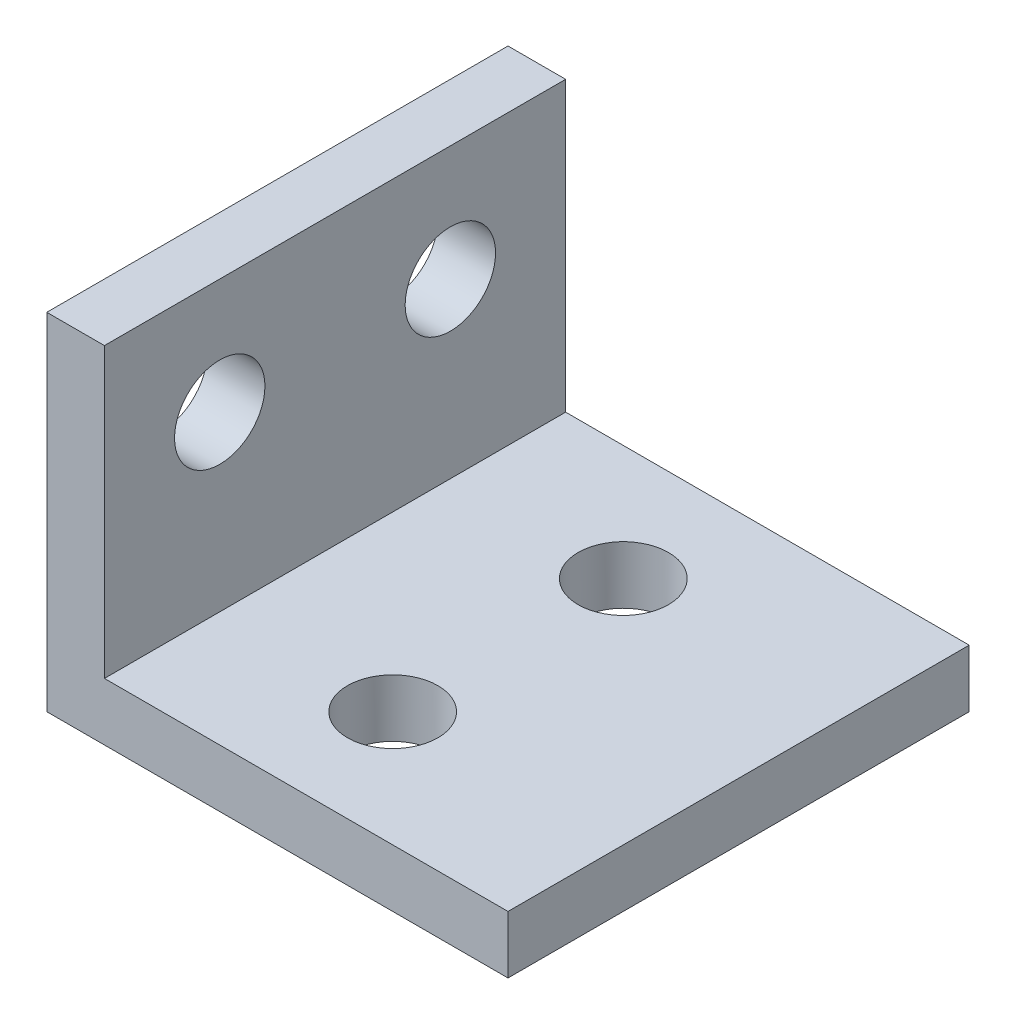
ISO-10303-21;
HEADER;
FILE_DESCRIPTION(('STEP AP214'),'2;1');
FILE_NAME('part.step','',(''),(''),'','','');
FILE_SCHEMA(('AUTOMOTIVE_DESIGN { 1 0 10303 214 1 1 1 1 }'));
ENDSEC;
DATA;
#1=APPLICATION_CONTEXT('core data for automotive mechanical design processes');
#2=APPLICATION_PROTOCOL_DEFINITION('international standard','automotive_design',2000,#1);
#3=PRODUCT_CONTEXT('',#1,'mechanical');
#4=PRODUCT('Part','Part','',(#3));
#5=PRODUCT_RELATED_PRODUCT_CATEGORY('part','',(#4));
#6=PRODUCT_DEFINITION_FORMATION('','',#4);
#7=PRODUCT_DEFINITION_CONTEXT('part definition',#1,'design');
#8=PRODUCT_DEFINITION('design','',#6,#7);
#9=PRODUCT_DEFINITION_SHAPE('','',#8);
#10=(LENGTH_UNIT() NAMED_UNIT(*) SI_UNIT(.MILLI.,.METRE.));
#11=(NAMED_UNIT(*) PLANE_ANGLE_UNIT() SI_UNIT($,.RADIAN.));
#12=(NAMED_UNIT(*) SI_UNIT($,.STERADIAN.) SOLID_ANGLE_UNIT());
#13=UNCERTAINTY_MEASURE_WITH_UNIT(LENGTH_MEASURE(1.E-05),#10,'distance_accuracy_value','');
#14=(GEOMETRIC_REPRESENTATION_CONTEXT(3) GLOBAL_UNCERTAINTY_ASSIGNED_CONTEXT((#13)) GLOBAL_UNIT_ASSIGNED_CONTEXT((#10,
#11,#12)) REPRESENTATION_CONTEXT('',''));
#15=CARTESIAN_POINT('',(0.,0.,0.));
#16=DIRECTION('',(0.,0.,1.));
#17=DIRECTION('',(1.,0.,0.));
#18=AXIS2_PLACEMENT_3D('',#15,#16,#17);
#19=CARTESIAN_POINT('',(25.4,0.,12.7));
#20=DIRECTION('',(0.,1.,0.));
#21=DIRECTION('',(-1.,0.,0.));
#22=AXIS2_PLACEMENT_3D('',#19,#20,#21);
#23=PLANE('',#22);
#24=CARTESIAN_POINT('',(12.7,0.,6.35));
#25=DIRECTION('',(0.,1.,0.));
#26=DIRECTION('',(0.,0.,1.));
#27=AXIS2_PLACEMENT_3D('',#24,#25,#26);
#28=CIRCLE('',#27,2.4892);
#29=CARTESIAN_POINT('',(12.7,0.,8.8392));
#30=VERTEX_POINT('',#29);
#31=EDGE_CURVE('E146',#30,#30,#28,.T.);
#32=ORIENTED_EDGE('',*,*,#31,.T.);
#33=EDGE_LOOP('',(#32));
#34=FACE_BOUND('',#33,.T.);
#35=CARTESIAN_POINT('',(12.7,0.,-6.35));
#36=DIRECTION('',(0.,1.,0.));
#37=DIRECTION('',(0.,0.,1.));
#38=AXIS2_PLACEMENT_3D('',#35,#36,#37);
#39=CIRCLE('',#38,2.4892);
#40=CARTESIAN_POINT('',(12.7,0.,-3.8608));
#41=VERTEX_POINT('',#40);
#42=EDGE_CURVE('E151',#41,#41,#39,.T.);
#43=ORIENTED_EDGE('',*,*,#42,.T.);
#44=EDGE_LOOP('',(#43));
#45=FACE_BOUND('',#44,.T.);
#46=DIRECTION('',(1.,0.,0.));
#47=VECTOR('',#46,1.);
#48=CARTESIAN_POINT('',(25.4,0.,-12.7));
#49=LINE('',#48,#47);
#50=CARTESIAN_POINT('',(0.,0.,-12.7));
#51=VERTEX_POINT('',#50);
#52=CARTESIAN_POINT('',(25.4,0.,-12.7));
#53=VERTEX_POINT('',#52);
#54=EDGE_CURVE('E129',#51,#53,#49,.T.);
#55=ORIENTED_EDGE('',*,*,#54,.T.);
#56=DIRECTION('',(0.,0.,-1.));
#57=VECTOR('',#56,1.);
#58=CARTESIAN_POINT('',(25.4,0.,12.7));
#59=LINE('',#58,#57);
#60=CARTESIAN_POINT('',(25.4,0.,12.7));
#61=VERTEX_POINT('',#60);
#62=EDGE_CURVE('E11',#61,#53,#59,.T.);
#63=ORIENTED_EDGE('',*,*,#62,.F.);
#64=DIRECTION('',(1.,0.,0.));
#65=VECTOR('',#64,1.);
#66=CARTESIAN_POINT('',(25.4,0.,12.7));
#67=LINE('',#66,#65);
#68=CARTESIAN_POINT('',(0.,0.,12.7));
#69=VERTEX_POINT('',#68);
#70=EDGE_CURVE('E139',#69,#61,#67,.T.);
#71=ORIENTED_EDGE('',*,*,#70,.F.);
#72=DIRECTION('',(0.,0.,-1.));
#73=VECTOR('',#72,1.);
#74=CARTESIAN_POINT('',(0.,0.,12.7));
#75=LINE('',#74,#73);
#76=EDGE_CURVE('E125',#69,#51,#75,.T.);
#77=ORIENTED_EDGE('',*,*,#76,.T.);
#78=EDGE_LOOP('',(#55,#63,#71,#77));
#79=FACE_BOUND('',#78,.T.);
#80=ADVANCED_FACE('F43',(#34,#45,#79),#23,.F.);
#81=CARTESIAN_POINT('',(25.4,3.175,12.7));
#82=DIRECTION('',(-1.,0.,0.));
#83=DIRECTION('',(0.,0.,1.));
#84=AXIS2_PLACEMENT_3D('',#81,#82,#83);
#85=PLANE('',#84);
#86=DIRECTION('',(0.,1.,0.));
#87=VECTOR('',#86,1.);
#88=CARTESIAN_POINT('',(25.4,3.175,-12.7));
#89=LINE('',#88,#87);
#90=CARTESIAN_POINT('',(25.4,3.175,-12.7));
#91=VERTEX_POINT('',#90);
#92=EDGE_CURVE('E132',#53,#91,#89,.T.);
#93=ORIENTED_EDGE('',*,*,#92,.T.);
#94=DIRECTION('',(0.,0.,-1.));
#95=VECTOR('',#94,1.);
#96=CARTESIAN_POINT('',(25.4,3.175,12.7));
#97=LINE('',#96,#95);
#98=CARTESIAN_POINT('',(25.4,3.175,12.7));
#99=VERTEX_POINT('',#98);
#100=EDGE_CURVE('E52',#99,#91,#97,.T.);
#101=ORIENTED_EDGE('',*,*,#100,.F.);
#102=DIRECTION('',(0.,1.,0.));
#103=VECTOR('',#102,1.);
#104=CARTESIAN_POINT('',(25.4,3.175,12.7));
#105=LINE('',#104,#103);
#106=EDGE_CURVE('E98',#61,#99,#105,.T.);
#107=ORIENTED_EDGE('',*,*,#106,.F.);
#108=ORIENTED_EDGE('',*,*,#62,.T.);
#109=EDGE_LOOP('',(#93,#101,#107,#108));
#110=FACE_BOUND('',#109,.T.);
#111=ADVANCED_FACE('F164',(#110),#85,.F.);
#112=CARTESIAN_POINT('',(3.175,3.175,12.7));
#113=DIRECTION('',(0.,-1.,0.));
#114=DIRECTION('',(0.,0.,-1.));
#115=AXIS2_PLACEMENT_3D('',#112,#113,#114);
#116=PLANE('',#115);
#117=CARTESIAN_POINT('',(12.7,3.175,6.35));
#118=DIRECTION('',(0.,-1.,0.));
#119=DIRECTION('',(0.,0.,-1.));
#120=AXIS2_PLACEMENT_3D('',#117,#118,#119);
#121=CIRCLE('',#120,2.4892);
#122=CARTESIAN_POINT('',(12.7,3.175,3.8608));
#123=VERTEX_POINT('',#122);
#124=EDGE_CURVE('E46',#123,#123,#121,.T.);
#125=ORIENTED_EDGE('',*,*,#124,.T.);
#126=EDGE_LOOP('',(#125));
#127=FACE_BOUND('',#126,.T.);
#128=CARTESIAN_POINT('',(12.7,3.175,-6.35));
#129=DIRECTION('',(0.,-1.,0.));
#130=DIRECTION('',(0.,0.,-1.));
#131=AXIS2_PLACEMENT_3D('',#128,#129,#130);
#132=CIRCLE('',#131,2.4892);
#133=CARTESIAN_POINT('',(12.7,3.175,-8.8392));
#134=VERTEX_POINT('',#133);
#135=EDGE_CURVE('E144',#134,#134,#132,.T.);
#136=ORIENTED_EDGE('',*,*,#135,.T.);
#137=EDGE_LOOP('',(#136));
#138=FACE_BOUND('',#137,.T.);
#139=DIRECTION('',(-1.,0.,0.));
#140=VECTOR('',#139,1.);
#141=CARTESIAN_POINT('',(3.175,3.175,-12.7));
#142=LINE('',#141,#140);
#143=CARTESIAN_POINT('',(3.175,3.175,-12.7));
#144=VERTEX_POINT('',#143);
#145=EDGE_CURVE('E134',#91,#144,#142,.T.);
#146=ORIENTED_EDGE('',*,*,#145,.T.);
#147=DIRECTION('',(0.,0.,-1.));
#148=VECTOR('',#147,1.);
#149=CARTESIAN_POINT('',(3.175,3.175,12.7));
#150=LINE('',#149,#148);
#151=CARTESIAN_POINT('',(3.175,3.175,12.7));
#152=VERTEX_POINT('',#151);
#153=EDGE_CURVE('E120',#152,#144,#150,.T.);
#154=ORIENTED_EDGE('',*,*,#153,.F.);
#155=DIRECTION('',(-1.,0.,0.));
#156=VECTOR('',#155,1.);
#157=CARTESIAN_POINT('',(3.175,3.175,12.7));
#158=LINE('',#157,#156);
#159=EDGE_CURVE('E111',#99,#152,#158,.T.);
#160=ORIENTED_EDGE('',*,*,#159,.F.);
#161=ORIENTED_EDGE('',*,*,#100,.T.);
#162=EDGE_LOOP('',(#146,#154,#160,#161));
#163=FACE_BOUND('',#162,.T.);
#164=ADVANCED_FACE('F167',(#127,#138,#163),#116,.F.);
#165=CARTESIAN_POINT('',(3.175,19.05,12.7));
#166=DIRECTION('',(-1.,0.,0.));
#167=DIRECTION('',(0.,-1.,0.));
#168=AXIS2_PLACEMENT_3D('',#165,#166,#167);
#169=PLANE('',#168);
#170=CARTESIAN_POINT('',(3.175,12.7,6.35));
#171=DIRECTION('',(-1.,0.,0.));
#172=DIRECTION('',(0.,-1.,0.));
#173=AXIS2_PLACEMENT_3D('',#170,#171,#172);
#174=CIRCLE('',#173,2.4892);
#175=CARTESIAN_POINT('',(3.175,10.2108,6.35));
#176=VERTEX_POINT('',#175);
#177=EDGE_CURVE('E156',#176,#176,#174,.T.);
#178=ORIENTED_EDGE('',*,*,#177,.T.);
#179=EDGE_LOOP('',(#178));
#180=FACE_BOUND('',#179,.T.);
#181=CARTESIAN_POINT('',(3.175,12.7,-6.35));
#182=DIRECTION('',(-1.,0.,0.));
#183=DIRECTION('',(0.,-1.,0.));
#184=AXIS2_PLACEMENT_3D('',#181,#182,#183);
#185=CIRCLE('',#184,2.4892);
#186=CARTESIAN_POINT('',(3.175,10.2108,-6.35));
#187=VERTEX_POINT('',#186);
#188=EDGE_CURVE('E221',#187,#187,#185,.T.);
#189=ORIENTED_EDGE('',*,*,#188,.T.);
#190=EDGE_LOOP('',(#189));
#191=FACE_BOUND('',#190,.T.);
#192=DIRECTION('',(0.,1.,0.));
#193=VECTOR('',#192,1.);
#194=CARTESIAN_POINT('',(3.175,19.05,-12.7));
#195=LINE('',#194,#193);
#196=CARTESIAN_POINT('',(3.175,19.05,-12.7));
#197=VERTEX_POINT('',#196);
#198=EDGE_CURVE('E119',#144,#197,#195,.T.);
#199=ORIENTED_EDGE('',*,*,#198,.T.);
#200=DIRECTION('',(0.,0.,-1.));
#201=VECTOR('',#200,1.);
#202=CARTESIAN_POINT('',(3.175,19.05,12.7));
#203=LINE('',#202,#201);
#204=CARTESIAN_POINT('',(3.175,19.05,12.7));
#205=VERTEX_POINT('',#204);
#206=EDGE_CURVE('E116',#205,#197,#203,.T.);
#207=ORIENTED_EDGE('',*,*,#206,.F.);
#208=DIRECTION('',(0.,1.,0.));
#209=VECTOR('',#208,1.);
#210=CARTESIAN_POINT('',(3.175,19.05,12.7));
#211=LINE('',#210,#209);
#212=EDGE_CURVE('E105',#152,#205,#211,.T.);
#213=ORIENTED_EDGE('',*,*,#212,.F.);
#214=ORIENTED_EDGE('',*,*,#153,.T.);
#215=EDGE_LOOP('',(#199,#207,#213,#214));
#216=FACE_BOUND('',#215,.T.);
#217=ADVANCED_FACE('F117',(#180,#191,#216),#169,.F.);
#218=CARTESIAN_POINT('',(0.,19.05,12.7));
#219=DIRECTION('',(0.,-1.,0.));
#220=DIRECTION('',(0.,0.,-1.));
#221=AXIS2_PLACEMENT_3D('',#218,#219,#220);
#222=PLANE('',#221);
#223=DIRECTION('',(-1.,0.,0.));
#224=VECTOR('',#223,1.);
#225=CARTESIAN_POINT('',(0.,19.05,-12.7));
#226=LINE('',#225,#224);
#227=CARTESIAN_POINT('',(0.,19.05,-12.7));
#228=VERTEX_POINT('',#227);
#229=EDGE_CURVE('E84',#197,#228,#226,.T.);
#230=ORIENTED_EDGE('',*,*,#229,.T.);
#231=DIRECTION('',(0.,0.,-1.));
#232=VECTOR('',#231,1.);
#233=CARTESIAN_POINT('',(0.,19.05,12.7));
#234=LINE('',#233,#232);
#235=CARTESIAN_POINT('',(0.,19.05,12.7));
#236=VERTEX_POINT('',#235);
#237=EDGE_CURVE('E121',#236,#228,#234,.T.);
#238=ORIENTED_EDGE('',*,*,#237,.F.);
#239=DIRECTION('',(-1.,0.,0.));
#240=VECTOR('',#239,1.);
#241=CARTESIAN_POINT('',(0.,19.05,12.7));
#242=LINE('',#241,#240);
#243=EDGE_CURVE('E109',#205,#236,#242,.T.);
#244=ORIENTED_EDGE('',*,*,#243,.F.);
#245=ORIENTED_EDGE('',*,*,#206,.T.);
#246=EDGE_LOOP('',(#230,#238,#244,#245));
#247=FACE_BOUND('',#246,.T.);
#248=ADVANCED_FACE('F123',(#247),#222,.F.);
#249=CARTESIAN_POINT('',(0.,0.,12.7));
#250=DIRECTION('',(1.,0.,0.));
#251=DIRECTION('',(0.,0.,-1.));
#252=AXIS2_PLACEMENT_3D('',#249,#250,#251);
#253=PLANE('',#252);
#254=CARTESIAN_POINT('',(0.,12.7,6.35));
#255=DIRECTION('',(1.,0.,0.));
#256=DIRECTION('',(0.,1.,0.));
#257=AXIS2_PLACEMENT_3D('',#254,#255,#256);
#258=CIRCLE('',#257,2.4892);
#259=CARTESIAN_POINT('',(0.,15.1892,6.35));
#260=VERTEX_POINT('',#259);
#261=EDGE_CURVE('E217',#260,#260,#258,.T.);
#262=ORIENTED_EDGE('',*,*,#261,.T.);
#263=EDGE_LOOP('',(#262));
#264=FACE_BOUND('',#263,.T.);
#265=CARTESIAN_POINT('',(0.,12.7,-6.35));
#266=DIRECTION('',(1.,0.,0.));
#267=DIRECTION('',(0.,1.,0.));
#268=AXIS2_PLACEMENT_3D('',#265,#266,#267);
#269=CIRCLE('',#268,2.4892);
#270=CARTESIAN_POINT('',(0.,15.1892,-6.35));
#271=VERTEX_POINT('',#270);
#272=EDGE_CURVE('E225',#271,#271,#269,.T.);
#273=ORIENTED_EDGE('',*,*,#272,.T.);
#274=EDGE_LOOP('',(#273));
#275=FACE_BOUND('',#274,.T.);
#276=DIRECTION('',(0.,-1.,0.));
#277=VECTOR('',#276,1.);
#278=CARTESIAN_POINT('',(0.,0.,-12.7));
#279=LINE('',#278,#277);
#280=EDGE_CURVE('E90',#228,#51,#279,.T.);
#281=ORIENTED_EDGE('',*,*,#280,.T.);
#282=ORIENTED_EDGE('',*,*,#76,.F.);
#283=DIRECTION('',(0.,-1.,0.));
#284=VECTOR('',#283,1.);
#285=CARTESIAN_POINT('',(0.,0.,12.7));
#286=LINE('',#285,#284);
#287=EDGE_CURVE('E61',#236,#69,#286,.T.);
#288=ORIENTED_EDGE('',*,*,#287,.F.);
#289=ORIENTED_EDGE('',*,*,#237,.T.);
#290=EDGE_LOOP('',(#281,#282,#288,#289));
#291=FACE_BOUND('',#290,.T.);
#292=ADVANCED_FACE('F172',(#264,#275,#291),#253,.F.);
#293=CARTESIAN_POINT('',(0.,0.,12.7));
#294=DIRECTION('',(0.,0.,-1.));
#295=DIRECTION('',(-1.,0.,0.));
#296=AXIS2_PLACEMENT_3D('',#293,#294,#295);
#297=PLANE('',#296);
#298=ORIENTED_EDGE('',*,*,#70,.T.);
#299=ORIENTED_EDGE('',*,*,#106,.T.);
#300=ORIENTED_EDGE('',*,*,#159,.T.);
#301=ORIENTED_EDGE('',*,*,#212,.T.);
#302=ORIENTED_EDGE('',*,*,#243,.T.);
#303=ORIENTED_EDGE('',*,*,#287,.T.);
#304=EDGE_LOOP('',(#298,#299,#300,#301,#302,#303));
#305=FACE_BOUND('',#304,.T.);
#306=ADVANCED_FACE('F107',(#305),#297,.F.);
#307=CARTESIAN_POINT('',(0.,0.,-12.7));
#308=DIRECTION('',(0.,0.,-1.));
#309=DIRECTION('',(-1.,0.,0.));
#310=AXIS2_PLACEMENT_3D('',#307,#308,#309);
#311=PLANE('',#310);
#312=ORIENTED_EDGE('',*,*,#54,.F.);
#313=ORIENTED_EDGE('',*,*,#280,.F.);
#314=ORIENTED_EDGE('',*,*,#229,.F.);
#315=ORIENTED_EDGE('',*,*,#198,.F.);
#316=ORIENTED_EDGE('',*,*,#145,.F.);
#317=ORIENTED_EDGE('',*,*,#92,.F.);
#318=EDGE_LOOP('',(#312,#313,#314,#315,#316,#317));
#319=FACE_BOUND('',#318,.T.);
#320=ADVANCED_FACE('F170',(#319),#311,.T.);
#321=CARTESIAN_POINT('',(12.7,0.,-6.35));
#322=DIRECTION('',(0.,1.,0.));
#323=DIRECTION('',(0.,0.,1.));
#324=AXIS2_PLACEMENT_3D('',#321,#322,#323);
#325=CYLINDRICAL_SURFACE('',#324,2.4892);
#326=ORIENTED_EDGE('',*,*,#42,.F.);
#327=EDGE_LOOP('',(#326));
#328=FACE_BOUND('',#327,.T.);
#329=ORIENTED_EDGE('',*,*,#135,.F.);
#330=EDGE_LOOP('',(#329));
#331=FACE_BOUND('',#330,.T.);
#332=ADVANCED_FACE('F196',(#328,#331),#325,.F.);
#333=CARTESIAN_POINT('',(12.7,0.,6.35));
#334=DIRECTION('',(0.,1.,0.));
#335=DIRECTION('',(0.,0.,1.));
#336=AXIS2_PLACEMENT_3D('',#333,#334,#335);
#337=CYLINDRICAL_SURFACE('',#336,2.4892);
#338=ORIENTED_EDGE('',*,*,#31,.F.);
#339=EDGE_LOOP('',(#338));
#340=FACE_BOUND('',#339,.T.);
#341=ORIENTED_EDGE('',*,*,#124,.F.);
#342=EDGE_LOOP('',(#341));
#343=FACE_BOUND('',#342,.T.);
#344=ADVANCED_FACE('F199',(#340,#343),#337,.F.);
#345=CARTESIAN_POINT('',(0.,12.7,-6.35));
#346=DIRECTION('',(1.,0.,0.));
#347=DIRECTION('',(0.,1.,0.));
#348=AXIS2_PLACEMENT_3D('',#345,#346,#347);
#349=CYLINDRICAL_SURFACE('',#348,2.4892);
#350=ORIENTED_EDGE('',*,*,#272,.F.);
#351=EDGE_LOOP('',(#350));
#352=FACE_BOUND('',#351,.T.);
#353=ORIENTED_EDGE('',*,*,#188,.F.);
#354=EDGE_LOOP('',(#353));
#355=FACE_BOUND('',#354,.T.);
#356=ADVANCED_FACE('F204',(#352,#355),#349,.F.);
#357=CARTESIAN_POINT('',(0.,12.7,6.35));
#358=DIRECTION('',(1.,0.,0.));
#359=DIRECTION('',(0.,1.,0.));
#360=AXIS2_PLACEMENT_3D('',#357,#358,#359);
#361=CYLINDRICAL_SURFACE('',#360,2.4892);
#362=ORIENTED_EDGE('',*,*,#261,.F.);
#363=EDGE_LOOP('',(#362));
#364=FACE_BOUND('',#363,.T.);
#365=ORIENTED_EDGE('',*,*,#177,.F.);
#366=EDGE_LOOP('',(#365));
#367=FACE_BOUND('',#366,.T.);
#368=ADVANCED_FACE('F209',(#364,#367),#361,.F.);
#369=CLOSED_SHELL('',(#80,#111,#164,#217,#248,#292,#306,#320,#332,#344,#356,#368));
#370=MANIFOLD_SOLID_BREP('B2',#369);
#371=ADVANCED_BREP_SHAPE_REPRESENTATION('',(#18,#370),#14);
#372=SHAPE_DEFINITION_REPRESENTATION(#9,#371);
ENDSEC;
END-ISO-10303-21;
